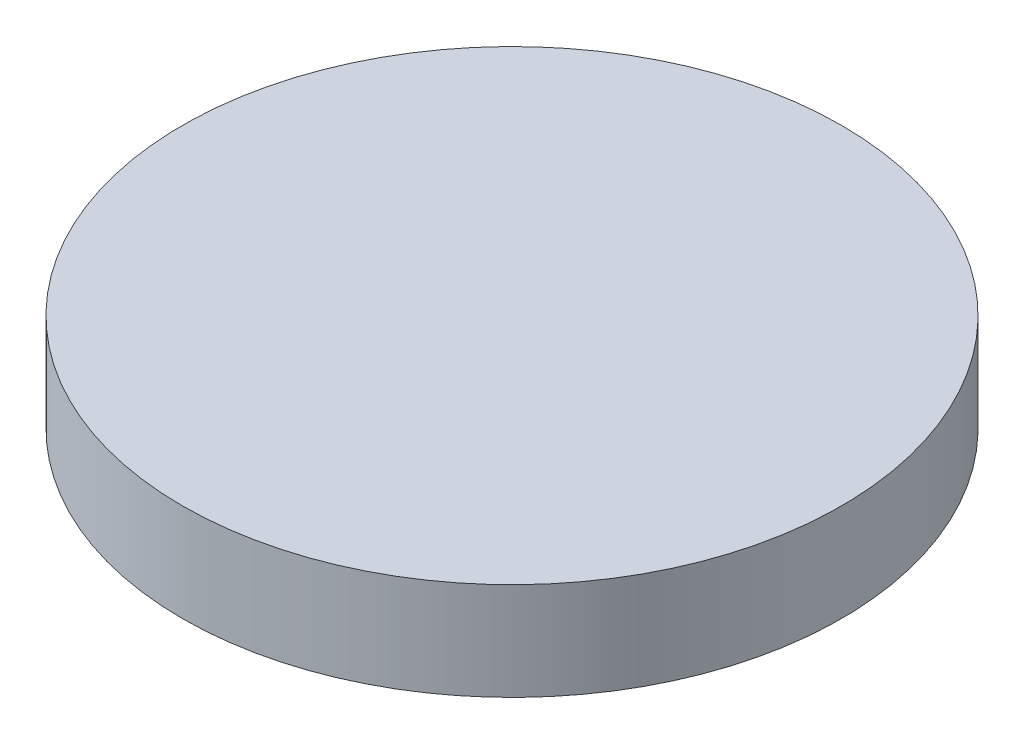
ISO-10303-21;
HEADER;
FILE_DESCRIPTION(('STEP AP214'),'2;1');
FILE_NAME('part.step','',(''),(''),'','','');
FILE_SCHEMA(('AUTOMOTIVE_DESIGN { 1 0 10303 214 1 1 1 1 }'));
ENDSEC;
DATA;
#1=APPLICATION_CONTEXT('core data for automotive mechanical design processes');
#2=APPLICATION_PROTOCOL_DEFINITION('international standard','automotive_design',2000,#1);
#3=PRODUCT_CONTEXT('',#1,'mechanical');
#4=PRODUCT('Part','Part','',(#3));
#5=PRODUCT_RELATED_PRODUCT_CATEGORY('part','',(#4));
#6=PRODUCT_DEFINITION_FORMATION('','',#4);
#7=PRODUCT_DEFINITION_CONTEXT('part definition',#1,'design');
#8=PRODUCT_DEFINITION('design','',#6,#7);
#9=PRODUCT_DEFINITION_SHAPE('','',#8);
#10=(LENGTH_UNIT() NAMED_UNIT(*) SI_UNIT(.MILLI.,.METRE.));
#11=(NAMED_UNIT(*) PLANE_ANGLE_UNIT() SI_UNIT($,.RADIAN.));
#12=(NAMED_UNIT(*) SI_UNIT($,.STERADIAN.) SOLID_ANGLE_UNIT());
#13=UNCERTAINTY_MEASURE_WITH_UNIT(LENGTH_MEASURE(1.E-05),#10,'distance_accuracy_value','');
#14=(GEOMETRIC_REPRESENTATION_CONTEXT(3) GLOBAL_UNCERTAINTY_ASSIGNED_CONTEXT((#13)) GLOBAL_UNIT_ASSIGNED_CONTEXT((#10,
#11,#12)) REPRESENTATION_CONTEXT('',''));
#15=CARTESIAN_POINT('',(0.,0.,0.));
#16=DIRECTION('',(0.,0.,1.));
#17=DIRECTION('',(1.,0.,0.));
#18=AXIS2_PLACEMENT_3D('',#15,#16,#17);
#19=CARTESIAN_POINT('',(0.,10.16,0.));
#20=DIRECTION('',(0.,-1.,0.));
#21=DIRECTION('',(0.,0.,-1.));
#22=AXIS2_PLACEMENT_3D('',#19,#20,#21);
#23=CYLINDRICAL_SURFACE('',#22,34.29);
#24=CARTESIAN_POINT('',(0.,10.16,0.));
#25=DIRECTION('',(0.,1.,0.));
#26=DIRECTION('',(0.,0.,1.));
#27=AXIS2_PLACEMENT_3D('',#24,#25,#26);
#28=CIRCLE('',#27,34.29);
#29=CARTESIAN_POINT('',(0.,10.16,34.29));
#30=VERTEX_POINT('',#29);
#31=EDGE_CURVE('E10',#30,#30,#28,.T.);
#32=ORIENTED_EDGE('',*,*,#31,.F.);
#33=EDGE_LOOP('',(#32));
#34=FACE_BOUND('',#33,.T.);
#35=CARTESIAN_POINT('',(0.,0.,0.));
#36=DIRECTION('',(0.,1.,0.));
#37=DIRECTION('',(0.,0.,1.));
#38=AXIS2_PLACEMENT_3D('',#35,#36,#37);
#39=CIRCLE('',#38,34.29);
#40=CARTESIAN_POINT('',(0.,0.,34.29));
#41=VERTEX_POINT('',#40);
#42=EDGE_CURVE('E40',#41,#41,#39,.T.);
#43=ORIENTED_EDGE('',*,*,#42,.T.);
#44=EDGE_LOOP('',(#43));
#45=FACE_BOUND('',#44,.T.);
#46=ADVANCED_FACE('F37',(#34,#45),#23,.T.);
#47=CARTESIAN_POINT('',(0.,10.16,0.));
#48=DIRECTION('',(0.,1.,0.));
#49=DIRECTION('',(0.,0.,1.));
#50=AXIS2_PLACEMENT_3D('',#47,#48,#49);
#51=PLANE('',#50);
#52=ORIENTED_EDGE('',*,*,#31,.T.);
#53=EDGE_LOOP('',(#52));
#54=FACE_BOUND('',#53,.T.);
#55=ADVANCED_FACE('F54',(#54),#51,.T.);
#56=CARTESIAN_POINT('',(0.,0.,0.));
#57=DIRECTION('',(0.,1.,0.));
#58=DIRECTION('',(0.,0.,1.));
#59=AXIS2_PLACEMENT_3D('',#56,#57,#58);
#60=PLANE('',#59);
#61=ORIENTED_EDGE('',*,*,#42,.F.);
#62=EDGE_LOOP('',(#61));
#63=FACE_BOUND('',#62,.T.);
#64=ADVANCED_FACE('F52',(#63),#60,.F.);
#65=CLOSED_SHELL('',(#46,#55,#64));
#66=MANIFOLD_SOLID_BREP('B2',#65);
#67=ADVANCED_BREP_SHAPE_REPRESENTATION('',(#18,#66),#14);
#68=SHAPE_DEFINITION_REPRESENTATION(#9,#67);
ENDSEC;
END-ISO-10303-21;
